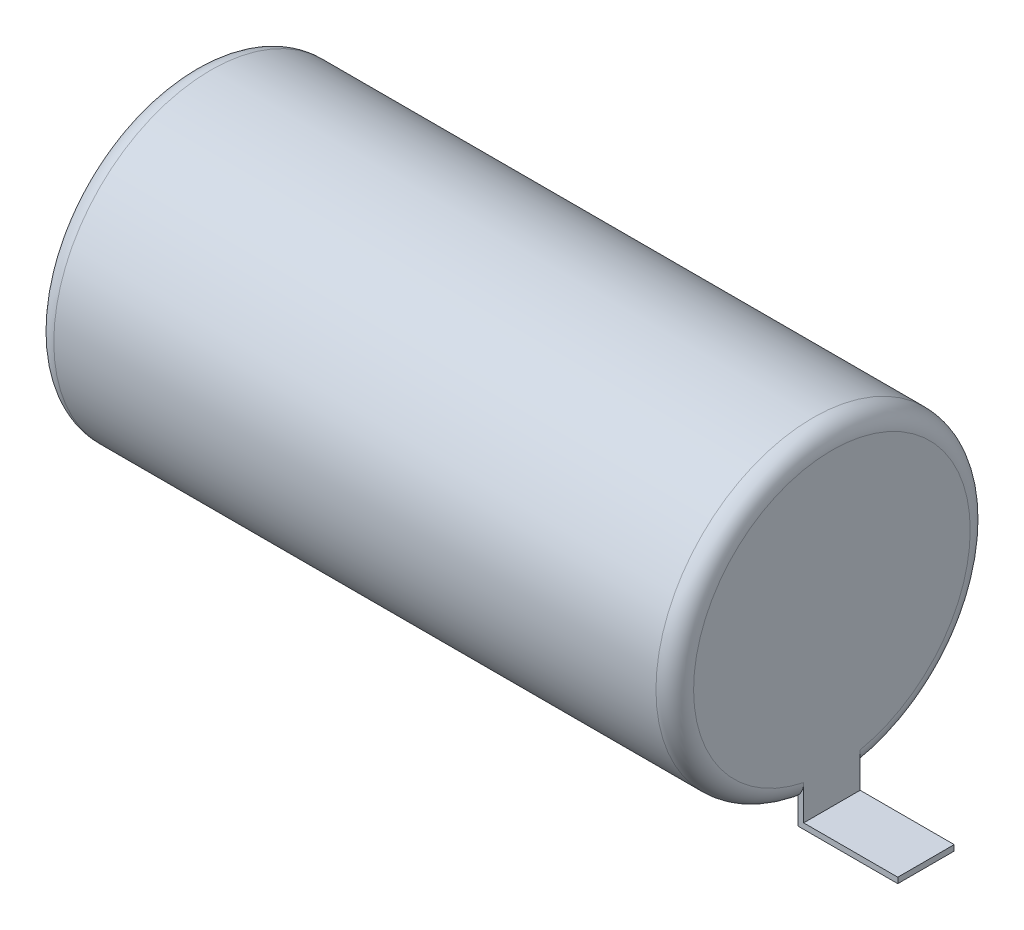
ISO-10303-21;
HEADER;
FILE_DESCRIPTION(('STEP AP214'),'2;1');
FILE_NAME('part.step','',(''),(''),'','','');
FILE_SCHEMA(('AUTOMOTIVE_DESIGN { 1 0 10303 214 1 1 1 1 }'));
ENDSEC;
DATA;
#1=APPLICATION_CONTEXT('core data for automotive mechanical design processes');
#2=APPLICATION_PROTOCOL_DEFINITION('international standard','automotive_design',2000,#1);
#3=PRODUCT_CONTEXT('',#1,'mechanical');
#4=PRODUCT('Part','Part','',(#3));
#5=PRODUCT_RELATED_PRODUCT_CATEGORY('part','',(#4));
#6=PRODUCT_DEFINITION_FORMATION('','',#4);
#7=PRODUCT_DEFINITION_CONTEXT('part definition',#1,'design');
#8=PRODUCT_DEFINITION('design','',#6,#7);
#9=PRODUCT_DEFINITION_SHAPE('','',#8);
#10=(LENGTH_UNIT() NAMED_UNIT(*) SI_UNIT(.MILLI.,.METRE.));
#11=(NAMED_UNIT(*) PLANE_ANGLE_UNIT() SI_UNIT($,.RADIAN.));
#12=(NAMED_UNIT(*) SI_UNIT($,.STERADIAN.) SOLID_ANGLE_UNIT());
#13=UNCERTAINTY_MEASURE_WITH_UNIT(LENGTH_MEASURE(1.E-05),#10,'distance_accuracy_value','');
#14=(GEOMETRIC_REPRESENTATION_CONTEXT(3) GLOBAL_UNCERTAINTY_ASSIGNED_CONTEXT((#13)) GLOBAL_UNIT_ASSIGNED_CONTEXT((#10,
#11,#12)) REPRESENTATION_CONTEXT('',''));
#15=CARTESIAN_POINT('',(0.,0.,0.));
#16=DIRECTION('',(0.,0.,1.));
#17=DIRECTION('',(1.,0.,0.));
#18=AXIS2_PLACEMENT_3D('',#15,#16,#17);
#19=CARTESIAN_POINT('',(-16.,0.,0.));
#20=DIRECTION('',(1.,0.,0.));
#21=DIRECTION('',(0.,0.,-1.));
#22=AXIS2_PLACEMENT_3D('',#19,#20,#21);
#23=TOROIDAL_SURFACE('',#22,7.35,1.);
#24=CARTESIAN_POINT('',(-16.,0.,0.));
#25=DIRECTION('',(1.,0.,0.));
#26=DIRECTION('',(0.,0.,-1.));
#27=AXIS2_PLACEMENT_3D('',#24,#25,#26);
#28=CIRCLE('',#27,8.35);
#29=CARTESIAN_POINT('',(-16.,0.,-8.35));
#30=VERTEX_POINT('',#29);
#31=EDGE_CURVE('E217',#30,#30,#28,.T.);
#32=ORIENTED_EDGE('',*,*,#31,.F.);
#33=EDGE_LOOP('',(#32));
#34=FACE_BOUND('',#33,.T.);
#35=CARTESIAN_POINT('',(-17.,0.,0.));
#36=DIRECTION('',(1.,0.,0.));
#37=DIRECTION('',(0.,0.,-1.));
#38=AXIS2_PLACEMENT_3D('',#35,#36,#37);
#39=CIRCLE('',#38,7.35);
#40=CARTESIAN_POINT('',(-17.,-7.19531097312687,1.5));
#41=VERTEX_POINT('',#40);
#42=CARTESIAN_POINT('',(-17.,-7.19531097312688,-1.5));
#43=VERTEX_POINT('',#42);
#44=EDGE_CURVE('E220',#41,#43,#39,.F.);
#45=ORIENTED_EDGE('',*,*,#44,.F.);
#46=CARTESIAN_POINT('',(-15.5067757970681,-6.30409923299321,1.5));
#47=CARTESIAN_POINT('',(-15.5305842653374,-6.29022336257219,1.5));
#48=CARTESIAN_POINT('',(-15.5549591096663,-6.27734333419591,1.5));
#49=CARTESIAN_POINT('',(-15.6046990759526,-6.25366062634084,1.5));
#50=CARTESIAN_POINT('',(-15.6300642444978,-6.24285804473339,1.5));
#51=CARTESIAN_POINT('',(-15.7073608834947,-6.21372212304803,1.5));
#52=CARTESIAN_POINT('',(-15.7605562522935,-6.19862402153742,1.5));
#53=CARTESIAN_POINT('',(-15.8687582447833,-6.17761792656011,1.5));
#54=CARTESIAN_POINT('',(-15.9237664941909,-6.1717184243746,1.5));
#55=CARTESIAN_POINT('',(-16.0339731529705,-6.16932456887729,1.5));
#56=CARTESIAN_POINT('',(-16.0891714783419,-6.1728264891976,1.5));
#57=CARTESIAN_POINT('',(-16.1977447366298,-6.18904562640387,1.5));
#58=CARTESIAN_POINT('',(-16.2511306389927,-6.20168973053703,1.5));
#59=CARTESIAN_POINT('',(-16.3550603895573,-6.23569237787235,1.5));
#60=CARTESIAN_POINT('',(-16.4056035557428,-6.25705300223981,1.5));
#61=CARTESIAN_POINT('',(-16.5028737573544,-6.30801449644528,1.5));
#62=CARTESIAN_POINT('',(-16.5495661129046,-6.3376814814608,1.5));
#63=CARTESIAN_POINT('',(-16.6374516761709,-6.4042624786784,1.5));
#64=CARTESIAN_POINT('',(-16.6786447395307,-6.44117668105717,1.5));
#65=CARTESIAN_POINT('',(-16.7554011842381,-6.52211702270089,1.5));
#66=CARTESIAN_POINT('',(-16.7908106051356,-6.56628913346842,1.5));
#67=CARTESIAN_POINT('',(-16.8539264131727,-6.65983174807836,1.5));
#68=CARTESIAN_POINT('',(-16.8816315861218,-6.70920306962857,1.5));
#69=CARTESIAN_POINT('',(-16.929247195065,-6.81305726264819,1.5));
#70=CARTESIAN_POINT('',(-16.9489479184186,-6.86763635005943,1.5));
#71=CARTESIAN_POINT('',(-16.9790514814456,-6.97930203969469,1.5));
#72=CARTESIAN_POINT('',(-16.9894535381439,-7.03638885265203,1.5));
#73=CARTESIAN_POINT('',(-17.0007597344184,-7.15230969163102,1.5));
#74=CARTESIAN_POINT('',(-17.0015283225254,-7.21115699767991,1.5));
#75=CARTESIAN_POINT('',(-16.9931660034458,-7.32814657860345,1.5));
#76=CARTESIAN_POINT('',(-16.9840349494277,-7.38628884300799,1.5));
#77=CARTESIAN_POINT('',(-16.9560922622193,-7.50013263557749,1.5));
#78=CARTESIAN_POINT('',(-16.9372916322517,-7.5558368600303,1.5));
#79=CARTESIAN_POINT('',(-16.8904829530109,-7.66323533308341,1.5));
#80=CARTESIAN_POINT('',(-16.8624754203273,-7.7149298064655,1.5));
#81=CARTESIAN_POINT('',(-16.7984205729262,-7.81210102602569,1.5));
#82=CARTESIAN_POINT('',(-16.7624835276978,-7.85765043182119,1.5));
#83=CARTESIAN_POINT('',(-16.683344715982,-7.94192958854867,1.5));
#84=CARTESIAN_POINT('',(-16.640143689483,-7.98066003331259,1.5));
#85=CARTESIAN_POINT('',(-16.5485372776916,-8.04946171674048,1.5));
#86=CARTESIAN_POINT('',(-16.5002393449575,-8.07967603265202,1.5));
#87=CARTESIAN_POINT('',(-16.3991947064606,-8.13141518622947,1.5));
#88=CARTESIAN_POINT('',(-16.3464485038068,-8.15294100499418,1.5));
#89=CARTESIAN_POINT('',(-16.2389052697222,-8.1863551252884,1.5));
#90=CARTESIAN_POINT('',(-16.1841539394948,-8.19839064024423,1.5));
#91=CARTESIAN_POINT('',(-16.0733921454941,-8.2130110849478,1.5));
#92=CARTESIAN_POINT('',(-16.0173815245852,-8.21559482863413,1.5));
#93=CARTESIAN_POINT('',(-15.9062006178464,-8.21124979677329,1.5));
#94=CARTESIAN_POINT('',(-15.8510272068893,-8.20439878523546,1.5));
#95=CARTESIAN_POINT('',(-15.7426439525426,-8.18152815186926,1.5));
#96=CARTESIAN_POINT('',(-15.6894321010441,-8.16551820038187,1.5));
#97=CARTESIAN_POINT('',(-15.6153504883957,-8.1362692152943,1.5));
#98=CARTESIAN_POINT('',(-15.5930577165142,-8.1264999244577,1.5));
#99=CARTESIAN_POINT('',(-15.5492914106264,-8.10537034823233,1.5));
#100=CARTESIAN_POINT('',(-15.5278164027691,-8.09401311607137,1.5));
#101=CARTESIAN_POINT('',(-15.5067757970681,-8.08188051333717,1.5));
#102=B_SPLINE_CURVE_WITH_KNOTS('',3,(#46,#47,#48,#49,#50,#51,#52,#53,#54,#55,#56,#57,#58,#59,
#60,#61,#62,#63,#64,#65,#66,#67,#68,#69,#70,#71,#72,#73,#74,#75,#76,#77,#78,#79,#80,#81,#82,#83,
#84,#85,#86,#87,#88,#89,#90,#91,#92,#93,#94,#95,#96,#97,#98,#99,#100,#101),.UNSPECIFIED.,.F.,
.F.,(4,2,2,2,2,2,2,2,2,2,2,2,2,2,2,2,2,2,2,2,2,2,2,2,2,2,2,4),(0.,0.0826221812848392,
0.165248254059607,0.330285193748819,0.495474390004246,0.660598121184733,0.824415712101748,
0.988272439181508,1.15347240624558,1.31867670895758,1.48773958171912,1.65682908373012,
1.83010026252789,2.00338602989359,2.17910738872757,2.35483135389687,2.53035579986591,
2.70587039902531,2.87908291695016,3.05227780023538,3.22236089138412,3.3924247714968,
3.55979567335305,3.72718757713088,3.89320801475991,4.05905348465827,4.13201744041258,
4.20484298554671),.UNSPECIFIED.);
#103=CARTESIAN_POINT('',(-16.7,-7.92340834426436,1.5));
#104=VERTEX_POINT('',#103);
#105=EDGE_CURVE('E11',#41,#104,#102,.T.);
#106=ORIENTED_EDGE('',*,*,#105,.T.);
#107=CARTESIAN_POINT('',(-16.7,0.,0.));
#108=DIRECTION('',(-1.,0.,0.));
#109=DIRECTION('',(0.,0.,1.));
#110=AXIS2_PLACEMENT_3D('',#107,#108,#109);
#111=CIRCLE('',#110,8.06414284285429);
#112=CARTESIAN_POINT('',(-16.7,-7.92340834426436,-1.5));
#113=VERTEX_POINT('',#112);
#114=EDGE_CURVE('E270',#104,#113,#111,.F.);
#115=ORIENTED_EDGE('',*,*,#114,.T.);
#116=CARTESIAN_POINT('',(-15.5067757970681,-8.08188051333716,-1.5));
#117=CARTESIAN_POINT('',(-15.5308383578399,-8.0957566107559,-1.5));
#118=CARTESIAN_POINT('',(-15.5554714134462,-8.10861789151575,-1.5));
#119=CARTESIAN_POINT('',(-15.6057287201951,-8.13223021688347,-1.5));
#120=CARTESIAN_POINT('',(-15.6313529677606,-8.1429812691064,-1.5));
#121=CARTESIAN_POINT('',(-15.7094116027768,-8.17191996821105,-1.5));
#122=CARTESIAN_POINT('',(-15.7631034176229,-8.18683436404292,-1.5));
#123=CARTESIAN_POINT('',(-15.8722421248031,-8.20741511907732,-1.5));
#124=CARTESIAN_POINT('',(-15.9276901790152,-8.21307521989462,-1.5));
#125=CARTESIAN_POINT('',(-16.0387385178251,-8.21496753356762,-1.5));
#126=CARTESIAN_POINT('',(-16.0943387545839,-8.21120243033194,-1.5));
#127=CARTESIAN_POINT('',(-16.2039089823935,-8.19439349739108,-1.5));
#128=CARTESIAN_POINT('',(-16.257884140551,-8.18138326224874,-1.5));
#129=CARTESIAN_POINT('',(-16.362906627279,-8.14651747548187,-1.5));
#130=CARTESIAN_POINT('',(-16.4139534156696,-8.12466029786382,-1.5));
#131=CARTESIAN_POINT('',(-16.5118849763461,-8.0726596086078,-1.5));
#132=CARTESIAN_POINT('',(-16.5587530030398,-8.04248458060819,-1.5));
#133=CARTESIAN_POINT('',(-16.6468328216077,-7.97478567048807,-1.5));
#134=CARTESIAN_POINT('',(-16.6880447320793,-7.9372619424949,-1.5));
#135=CARTESIAN_POINT('',(-16.7642022652973,-7.85545045041571,-1.5));
#136=CARTESIAN_POINT('',(-16.799064620725,-7.8110852001287,-1.5));
#137=CARTESIAN_POINT('',(-16.8609955130221,-7.71721337824321,-1.5));
#138=CARTESIAN_POINT('',(-16.8880632163161,-7.66770625753281,-1.5));
#139=CARTESIAN_POINT('',(-16.9341339248544,-7.56404678898978,-1.5));
#140=CARTESIAN_POINT('',(-16.9529898121658,-7.50982905957159,-1.5));
#141=CARTESIAN_POINT('',(-16.9814987999338,-7.39902653482781,-1.5));
#142=CARTESIAN_POINT('',(-16.991151085684,-7.3424415304128,-1.5));
#143=CARTESIAN_POINT('',(-17.0011262173479,-7.22749985459626,-1.5));
#144=CARTESIAN_POINT('',(-17.0012903440484,-7.16912938014377,-1.5));
#145=CARTESIAN_POINT('',(-16.9919134443733,-7.05317131497763,-1.5));
#146=CARTESIAN_POINT('',(-16.9823717049735,-6.99558378209636,-1.5));
#147=CARTESIAN_POINT('',(-16.953710524679,-6.88227754792207,-1.5));
#148=CARTESIAN_POINT('',(-16.9345040933504,-6.82658081548269,-1.5));
#149=CARTESIAN_POINT('',(-16.8869718664512,-6.7192202733008,-1.5));
#150=CARTESIAN_POINT('',(-16.8586459909411,-6.66755649891542,-1.5));
#151=CARTESIAN_POINT('',(-16.7937695740262,-6.5700274870711,-1.5));
#152=CARTESIAN_POINT('',(-16.7572585298431,-6.5241360028987,-1.5));
#153=CARTESIAN_POINT('',(-16.6769092177,-6.43928692575321,-1.5));
#154=CARTESIAN_POINT('',(-16.6330717081814,-6.40032861591367,-1.5));
#155=CARTESIAN_POINT('',(-16.5402185279286,-6.33130698491065,-1.5));
#156=CARTESIAN_POINT('',(-16.4913221834213,-6.30108322842729,-1.5));
#157=CARTESIAN_POINT('',(-16.3890450787671,-6.24953334441582,-1.5));
#158=CARTESIAN_POINT('',(-16.3356651591678,-6.22820555359056,-1.5));
#159=CARTESIAN_POINT('',(-16.2274539524268,-6.195630779563,-1.5));
#160=CARTESIAN_POINT('',(-16.1726983298977,-6.18413222404921,-1.5));
#161=CARTESIAN_POINT('',(-16.0620167422656,-6.17067383691746,-1.5));
#162=CARTESIAN_POINT('',(-16.0060907054638,-6.16871459139841,-1.5));
#163=CARTESIAN_POINT('',(-15.8956980603267,-6.1743517274725,-1.5));
#164=CARTESIAN_POINT('',(-15.8412228763283,-6.18178471482942,-1.5));
#165=CARTESIAN_POINT('',(-15.7343196106212,-6.20568068141844,-1.5));
#166=CARTESIAN_POINT('',(-15.6818894710572,-6.22213431852547,-1.5));
#167=CARTESIAN_POINT('',(-15.6097865010826,-6.25154784597752,-1.5));
#168=CARTESIAN_POINT('',(-15.5886499600778,-6.26105593547129,-1.5));
#169=CARTESIAN_POINT('',(-15.5471362326949,-6.2815107035309,-1.5));
#170=CARTESIAN_POINT('',(-15.5267576374871,-6.29245452224264,-1.5));
#171=CARTESIAN_POINT('',(-15.5067757970683,-6.30409923299312,-1.5));
#172=B_SPLINE_CURVE_WITH_KNOTS('',3,(#116,#117,#118,#119,#120,#121,#122,#123,#124,#125,#126,
#127,#128,#129,#130,#131,#132,#133,#134,#135,#136,#137,#138,#139,#140,#141,#142,#143,#144,#145,
#146,#147,#148,#149,#150,#151,#152,#153,#154,#155,#156,#157,#158,#159,#160,#161,#162,#163,#164,
#165,#166,#167,#168,#169,#170,#171),.UNSPECIFIED.,.F.,.F.,(4,2,2,2,2,2,2,2,2,2,2,2,2,2,2,2,2,2,
2,2,2,2,2,2,2,2,2,4),(0.,0.0832804639960968,0.166560627457247,0.332876426853083,
0.499304653879879,0.66568549441653,0.831464818807183,0.997274625886492,1.16372153346065,
1.3301649504481,1.49865463901482,1.66716233951222,1.83857581579042,2.01000446425008,
2.18429997873436,2.3586082984568,2.53451438156462,2.71042200667596,2.88549840026635,
3.06055668102731,3.23215862043355,3.40372846067138,3.57076303961578,3.73780788110032,
3.90198629286784,4.06599499558828,4.13547872655523,4.2048260955342),.UNSPECIFIED.);
#173=EDGE_CURVE('E54',#113,#43,#172,.T.);
#174=ORIENTED_EDGE('',*,*,#173,.T.);
#175=EDGE_LOOP('',(#45,#106,#115,#174));
#176=FACE_BOUND('',#175,.T.);
#177=ADVANCED_FACE('F40',(#34,#176),#23,.T.);
#178=CARTESIAN_POINT('',(17.,0.,0.));
#179=DIRECTION('',(1.,0.,0.));
#180=DIRECTION('',(0.,0.,-1.));
#181=AXIS2_PLACEMENT_3D('',#178,#179,#180);
#182=PLANE('',#181);
#183=DIRECTION('',(0.,-1.,0.));
#184=VECTOR('',#183,1.);
#185=CARTESIAN_POINT('',(17.,-9.35,1.5));
#186=LINE('',#185,#184);
#187=CARTESIAN_POINT('',(17.,-7.19531097312688,1.5));
#188=VERTEX_POINT('',#187);
#189=CARTESIAN_POINT('',(17.,-9.05,1.5));
#190=VERTEX_POINT('',#189);
#191=EDGE_CURVE('E198',#188,#190,#186,.T.);
#192=ORIENTED_EDGE('',*,*,#191,.T.);
#193=DIRECTION('',(0.,0.,1.));
#194=VECTOR('',#193,1.);
#195=CARTESIAN_POINT('',(17.,-9.05,1.5));
#196=LINE('',#195,#194);
#197=CARTESIAN_POINT('',(17.,-9.05,-1.5));
#198=VERTEX_POINT('',#197);
#199=EDGE_CURVE('E147',#198,#190,#196,.T.);
#200=ORIENTED_EDGE('',*,*,#199,.F.);
#201=DIRECTION('',(0.,1.,0.));
#202=VECTOR('',#201,1.);
#203=CARTESIAN_POINT('',(17.,-9.35,-1.5));
#204=LINE('',#203,#202);
#205=CARTESIAN_POINT('',(17.,-7.19531097312687,-1.5));
#206=VERTEX_POINT('',#205);
#207=EDGE_CURVE('E202',#198,#206,#204,.T.);
#208=ORIENTED_EDGE('',*,*,#207,.T.);
#209=CARTESIAN_POINT('',(17.,0.,0.));
#210=DIRECTION('',(1.,0.,0.));
#211=DIRECTION('',(0.,0.,-1.));
#212=AXIS2_PLACEMENT_3D('',#209,#210,#211);
#213=CIRCLE('',#212,7.35);
#214=EDGE_CURVE('E222',#206,#188,#213,.T.);
#215=ORIENTED_EDGE('',*,*,#214,.T.);
#216=EDGE_LOOP('',(#192,#200,#208,#215));
#217=FACE_BOUND('',#216,.T.);
#218=ADVANCED_FACE('F250',(#217),#182,.T.);
#219=CARTESIAN_POINT('',(17.,0.,0.));
#220=DIRECTION('',(-1.,0.,0.));
#221=DIRECTION('',(0.,0.,1.));
#222=AXIS2_PLACEMENT_3D('',#219,#220,#221);
#223=CYLINDRICAL_SURFACE('',#222,8.35);
#224=ORIENTED_EDGE('',*,*,#31,.T.);
#225=EDGE_LOOP('',(#224));
#226=FACE_BOUND('',#225,.T.);
#227=CARTESIAN_POINT('',(16.,0.,0.));
#228=DIRECTION('',(1.,0.,0.));
#229=DIRECTION('',(0.,0.,-1.));
#230=AXIS2_PLACEMENT_3D('',#227,#228,#229);
#231=CIRCLE('',#230,8.35);
#232=CARTESIAN_POINT('',(16.,0.,-8.35));
#233=VERTEX_POINT('',#232);
#234=EDGE_CURVE('E213',#233,#233,#231,.F.);
#235=ORIENTED_EDGE('',*,*,#234,.T.);
#236=EDGE_LOOP('',(#235));
#237=FACE_BOUND('',#236,.T.);
#238=ADVANCED_FACE('F253',(#226,#237),#223,.T.);
#239=CARTESIAN_POINT('',(-17.,0.,0.));
#240=DIRECTION('',(1.,0.,0.));
#241=DIRECTION('',(0.,0.,-1.));
#242=AXIS2_PLACEMENT_3D('',#239,#240,#241);
#243=PLANE('',#242);
#244=DIRECTION('',(0.,1.,0.));
#245=VECTOR('',#244,1.);
#246=CARTESIAN_POINT('',(-17.,-9.35,-1.5));
#247=LINE('',#246,#245);
#248=CARTESIAN_POINT('',(-17.,-9.05,-1.5));
#249=VERTEX_POINT('',#248);
#250=EDGE_CURVE('E170',#249,#43,#247,.T.);
#251=ORIENTED_EDGE('',*,*,#250,.F.);
#252=DIRECTION('',(0.,0.,1.));
#253=VECTOR('',#252,1.);
#254=CARTESIAN_POINT('',(-17.,-9.05,1.5));
#255=LINE('',#254,#253);
#256=CARTESIAN_POINT('',(-17.,-9.05,1.5));
#257=VERTEX_POINT('',#256);
#258=EDGE_CURVE('E61',#249,#257,#255,.T.);
#259=ORIENTED_EDGE('',*,*,#258,.T.);
#260=DIRECTION('',(0.,-1.,0.));
#261=VECTOR('',#260,1.);
#262=CARTESIAN_POINT('',(-17.,-9.35,1.5));
#263=LINE('',#262,#261);
#264=EDGE_CURVE('E68',#41,#257,#263,.T.);
#265=ORIENTED_EDGE('',*,*,#264,.F.);
#266=ORIENTED_EDGE('',*,*,#44,.T.);
#267=EDGE_LOOP('',(#251,#259,#265,#266));
#268=FACE_BOUND('',#267,.T.);
#269=ADVANCED_FACE('F255',(#268),#243,.F.);
#270=CARTESIAN_POINT('',(16.,0.,0.));
#271=DIRECTION('',(1.,0.,0.));
#272=DIRECTION('',(0.,0.,-1.));
#273=AXIS2_PLACEMENT_3D('',#270,#271,#272);
#274=TOROIDAL_SURFACE('',#273,7.35,1.);
#275=CARTESIAN_POINT('',(15.5067757970681,-8.08188051333716,-1.5));
#276=CARTESIAN_POINT('',(15.5308383578399,-8.0957566107559,-1.5));
#277=CARTESIAN_POINT('',(15.5554714134462,-8.10861789151575,-1.5));
#278=CARTESIAN_POINT('',(15.6057287201951,-8.13223021688347,-1.5));
#279=CARTESIAN_POINT('',(15.6313529677606,-8.1429812691064,-1.5));
#280=CARTESIAN_POINT('',(15.7094116027768,-8.17191996821105,-1.5));
#281=CARTESIAN_POINT('',(15.7631034176229,-8.18683436404292,-1.5));
#282=CARTESIAN_POINT('',(15.8722421248031,-8.20741511907732,-1.5));
#283=CARTESIAN_POINT('',(15.9276901790152,-8.21307521989462,-1.5));
#284=CARTESIAN_POINT('',(16.0387385178251,-8.21496753356762,-1.5));
#285=CARTESIAN_POINT('',(16.0943387545839,-8.21120243033194,-1.5));
#286=CARTESIAN_POINT('',(16.2039089823935,-8.19439349739108,-1.5));
#287=CARTESIAN_POINT('',(16.257884140551,-8.18138326224874,-1.5));
#288=CARTESIAN_POINT('',(16.362906627279,-8.14651747548187,-1.5));
#289=CARTESIAN_POINT('',(16.4139534156696,-8.12466029786382,-1.5));
#290=CARTESIAN_POINT('',(16.5118849763461,-8.0726596086078,-1.5));
#291=CARTESIAN_POINT('',(16.5587530030398,-8.04248458060819,-1.5));
#292=CARTESIAN_POINT('',(16.6468328216077,-7.97478567048807,-1.5));
#293=CARTESIAN_POINT('',(16.6880447320793,-7.9372619424949,-1.5));
#294=CARTESIAN_POINT('',(16.7642022652973,-7.85545045041571,-1.5));
#295=CARTESIAN_POINT('',(16.799064620725,-7.8110852001287,-1.5));
#296=CARTESIAN_POINT('',(16.8609955130221,-7.71721337824321,-1.5));
#297=CARTESIAN_POINT('',(16.8880632163161,-7.66770625753281,-1.5));
#298=CARTESIAN_POINT('',(16.9341339248544,-7.56404678898978,-1.5));
#299=CARTESIAN_POINT('',(16.9529898121658,-7.50982905957159,-1.5));
#300=CARTESIAN_POINT('',(16.9814987999338,-7.39902653482781,-1.5));
#301=CARTESIAN_POINT('',(16.991151085684,-7.3424415304128,-1.5));
#302=CARTESIAN_POINT('',(17.0011262173479,-7.22749985459626,-1.5));
#303=CARTESIAN_POINT('',(17.0012903440484,-7.16912938014377,-1.5));
#304=CARTESIAN_POINT('',(16.9919134443733,-7.05317131497763,-1.5));
#305=CARTESIAN_POINT('',(16.9823717049735,-6.99558378209636,-1.5));
#306=CARTESIAN_POINT('',(16.953710524679,-6.88227754792207,-1.5));
#307=CARTESIAN_POINT('',(16.9345040933504,-6.82658081548269,-1.5));
#308=CARTESIAN_POINT('',(16.8869718664512,-6.7192202733008,-1.5));
#309=CARTESIAN_POINT('',(16.8586459909411,-6.66755649891542,-1.5));
#310=CARTESIAN_POINT('',(16.7937695740262,-6.5700274870711,-1.5));
#311=CARTESIAN_POINT('',(16.7572585298431,-6.5241360028987,-1.5));
#312=CARTESIAN_POINT('',(16.6769092177,-6.43928692575321,-1.5));
#313=CARTESIAN_POINT('',(16.6330717081814,-6.40032861591367,-1.5));
#314=CARTESIAN_POINT('',(16.5402185279286,-6.33130698491065,-1.5));
#315=CARTESIAN_POINT('',(16.4913221834213,-6.30108322842729,-1.5));
#316=CARTESIAN_POINT('',(16.3890450787671,-6.24953334441582,-1.5));
#317=CARTESIAN_POINT('',(16.3356651591678,-6.22820555359056,-1.5));
#318=CARTESIAN_POINT('',(16.2274539524268,-6.195630779563,-1.5));
#319=CARTESIAN_POINT('',(16.1726983298977,-6.18413222404921,-1.5));
#320=CARTESIAN_POINT('',(16.0620167422656,-6.17067383691746,-1.5));
#321=CARTESIAN_POINT('',(16.0060907054638,-6.16871459139841,-1.5));
#322=CARTESIAN_POINT('',(15.8956980603267,-6.1743517274725,-1.5));
#323=CARTESIAN_POINT('',(15.8412228763283,-6.18178471482942,-1.5));
#324=CARTESIAN_POINT('',(15.7343196106212,-6.20568068141844,-1.5));
#325=CARTESIAN_POINT('',(15.6818894710572,-6.22213431852547,-1.5));
#326=CARTESIAN_POINT('',(15.6097865010826,-6.25154784597752,-1.5));
#327=CARTESIAN_POINT('',(15.5886499600778,-6.26105593547129,-1.5));
#328=CARTESIAN_POINT('',(15.5471362326949,-6.2815107035309,-1.5));
#329=CARTESIAN_POINT('',(15.5267576374871,-6.29245452224264,-1.5));
#330=CARTESIAN_POINT('',(15.5067757970683,-6.30409923299312,-1.5));
#331=B_SPLINE_CURVE_WITH_KNOTS('',3,(#275,#276,#277,#278,#279,#280,#281,#282,#283,#284,#285,
#286,#287,#288,#289,#290,#291,#292,#293,#294,#295,#296,#297,#298,#299,#300,#301,#302,#303,#304,
#305,#306,#307,#308,#309,#310,#311,#312,#313,#314,#315,#316,#317,#318,#319,#320,#321,#322,#323,
#324,#325,#326,#327,#328,#329,#330),.UNSPECIFIED.,.F.,.F.,(4,2,2,2,2,2,2,2,2,2,2,2,2,2,2,2,2,2,
2,2,2,2,2,2,2,2,2,4),(0.,0.0832804639960968,0.166560627457247,0.332876426853083,
0.499304653879879,0.66568549441653,0.831464818807183,0.997274625886492,1.16372153346065,
1.3301649504481,1.49865463901482,1.66716233951222,1.83857581579042,2.01000446425008,
2.18429997873436,2.3586082984568,2.53451438156462,2.71042200667596,2.88549840026635,
3.06055668102731,3.23215862043355,3.40372846067138,3.57076303961578,3.73780788110032,
3.90198629286784,4.06599499558828,4.13547872655523,4.2048260955342),.UNSPECIFIED.);
#332=CARTESIAN_POINT('',(16.7,-7.92340834426436,-1.5));
#333=VERTEX_POINT('',#332);
#334=EDGE_CURVE('E235',#333,#206,#331,.T.);
#335=ORIENTED_EDGE('',*,*,#334,.F.);
#336=CARTESIAN_POINT('',(16.7,0.,0.));
#337=DIRECTION('',(1.,0.,0.));
#338=DIRECTION('',(0.,0.,-1.));
#339=AXIS2_PLACEMENT_3D('',#336,#337,#338);
#340=CIRCLE('',#339,8.06414284285429);
#341=CARTESIAN_POINT('',(16.7,-7.92340834426436,1.5));
#342=VERTEX_POINT('',#341);
#343=EDGE_CURVE('E225',#333,#342,#340,.F.);
#344=ORIENTED_EDGE('',*,*,#343,.T.);
#345=CARTESIAN_POINT('',(15.5067757970681,-6.30409923299321,1.5));
#346=CARTESIAN_POINT('',(15.5305842653374,-6.29022336257219,1.5));
#347=CARTESIAN_POINT('',(15.5549591096663,-6.27734333419591,1.5));
#348=CARTESIAN_POINT('',(15.6046990759526,-6.25366062634084,1.5));
#349=CARTESIAN_POINT('',(15.6300642444978,-6.24285804473339,1.5));
#350=CARTESIAN_POINT('',(15.7073608834947,-6.21372212304803,1.5));
#351=CARTESIAN_POINT('',(15.7605562522935,-6.19862402153742,1.5));
#352=CARTESIAN_POINT('',(15.8687582447833,-6.17761792656011,1.5));
#353=CARTESIAN_POINT('',(15.9237664941909,-6.1717184243746,1.5));
#354=CARTESIAN_POINT('',(16.0339731529705,-6.16932456887729,1.5));
#355=CARTESIAN_POINT('',(16.0891714783419,-6.1728264891976,1.5));
#356=CARTESIAN_POINT('',(16.1977447366298,-6.18904562640387,1.5));
#357=CARTESIAN_POINT('',(16.2511306389927,-6.20168973053703,1.5));
#358=CARTESIAN_POINT('',(16.3550603895573,-6.23569237787235,1.5));
#359=CARTESIAN_POINT('',(16.4056035557428,-6.25705300223981,1.5));
#360=CARTESIAN_POINT('',(16.5028737573544,-6.30801449644528,1.5));
#361=CARTESIAN_POINT('',(16.5495661129046,-6.3376814814608,1.5));
#362=CARTESIAN_POINT('',(16.6374516761709,-6.4042624786784,1.5));
#363=CARTESIAN_POINT('',(16.6786447395307,-6.44117668105717,1.5));
#364=CARTESIAN_POINT('',(16.7554011842381,-6.52211702270089,1.5));
#365=CARTESIAN_POINT('',(16.7908106051356,-6.56628913346842,1.5));
#366=CARTESIAN_POINT('',(16.8539264131727,-6.65983174807836,1.5));
#367=CARTESIAN_POINT('',(16.8816315861218,-6.70920306962857,1.5));
#368=CARTESIAN_POINT('',(16.929247195065,-6.81305726264819,1.5));
#369=CARTESIAN_POINT('',(16.9489479184186,-6.86763635005943,1.5));
#370=CARTESIAN_POINT('',(16.9790514814456,-6.97930203969469,1.5));
#371=CARTESIAN_POINT('',(16.9894535381439,-7.03638885265203,1.5));
#372=CARTESIAN_POINT('',(17.0007597344184,-7.15230969163102,1.5));
#373=CARTESIAN_POINT('',(17.0015283225254,-7.21115699767991,1.5));
#374=CARTESIAN_POINT('',(16.9931660034458,-7.32814657860345,1.5));
#375=CARTESIAN_POINT('',(16.9840349494277,-7.38628884300799,1.5));
#376=CARTESIAN_POINT('',(16.9560922622193,-7.50013263557749,1.5));
#377=CARTESIAN_POINT('',(16.9372916322517,-7.5558368600303,1.5));
#378=CARTESIAN_POINT('',(16.8904829530109,-7.66323533308341,1.5));
#379=CARTESIAN_POINT('',(16.8624754203273,-7.7149298064655,1.5));
#380=CARTESIAN_POINT('',(16.7984205729262,-7.81210102602569,1.5));
#381=CARTESIAN_POINT('',(16.7624835276978,-7.85765043182119,1.5));
#382=CARTESIAN_POINT('',(16.683344715982,-7.94192958854867,1.5));
#383=CARTESIAN_POINT('',(16.640143689483,-7.98066003331259,1.5));
#384=CARTESIAN_POINT('',(16.5485372776916,-8.04946171674048,1.5));
#385=CARTESIAN_POINT('',(16.5002393449575,-8.07967603265202,1.5));
#386=CARTESIAN_POINT('',(16.3991947064606,-8.13141518622947,1.5));
#387=CARTESIAN_POINT('',(16.3464485038068,-8.15294100499418,1.5));
#388=CARTESIAN_POINT('',(16.2389052697222,-8.1863551252884,1.5));
#389=CARTESIAN_POINT('',(16.1841539394948,-8.19839064024423,1.5));
#390=CARTESIAN_POINT('',(16.0733921454941,-8.2130110849478,1.5));
#391=CARTESIAN_POINT('',(16.0173815245852,-8.21559482863413,1.5));
#392=CARTESIAN_POINT('',(15.9062006178464,-8.21124979677329,1.5));
#393=CARTESIAN_POINT('',(15.8510272068893,-8.20439878523546,1.5));
#394=CARTESIAN_POINT('',(15.7426439525426,-8.18152815186926,1.5));
#395=CARTESIAN_POINT('',(15.6894321010441,-8.16551820038187,1.5));
#396=CARTESIAN_POINT('',(15.6153504883957,-8.1362692152943,1.5));
#397=CARTESIAN_POINT('',(15.5930577165142,-8.1264999244577,1.5));
#398=CARTESIAN_POINT('',(15.5492914106264,-8.10537034823233,1.5));
#399=CARTESIAN_POINT('',(15.5278164027691,-8.09401311607137,1.5));
#400=CARTESIAN_POINT('',(15.5067757970681,-8.08188051333717,1.5));
#401=B_SPLINE_CURVE_WITH_KNOTS('',3,(#345,#346,#347,#348,#349,#350,#351,#352,#353,#354,#355,
#356,#357,#358,#359,#360,#361,#362,#363,#364,#365,#366,#367,#368,#369,#370,#371,#372,#373,#374,
#375,#376,#377,#378,#379,#380,#381,#382,#383,#384,#385,#386,#387,#388,#389,#390,#391,#392,#393,
#394,#395,#396,#397,#398,#399,#400),.UNSPECIFIED.,.F.,.F.,(4,2,2,2,2,2,2,2,2,2,2,2,2,2,2,2,2,2,
2,2,2,2,2,2,2,2,2,4),(0.,0.0826221812848392,0.165248254059607,0.330285193748819,
0.495474390004246,0.660598121184733,0.824415712101748,0.988272439181508,1.15347240624558,
1.31867670895758,1.48773958171912,1.65682908373012,1.83010026252789,2.00338602989359,
2.17910738872757,2.35483135389687,2.53035579986591,2.70587039902531,2.87908291695016,
3.05227780023538,3.22236089138412,3.3924247714968,3.55979567335305,3.72718757713088,
3.89320801475991,4.05905348465827,4.13201744041258,4.20484298554671),.UNSPECIFIED.);
#402=EDGE_CURVE('E228',#188,#342,#401,.T.);
#403=ORIENTED_EDGE('',*,*,#402,.F.);
#404=ORIENTED_EDGE('',*,*,#214,.F.);
#405=EDGE_LOOP('',(#335,#344,#403,#404));
#406=FACE_BOUND('',#405,.T.);
#407=ORIENTED_EDGE('',*,*,#234,.F.);
#408=EDGE_LOOP('',(#407));
#409=FACE_BOUND('',#408,.T.);
#410=ADVANCED_FACE('F42',(#406,#409),#274,.T.);
#411=CARTESIAN_POINT('',(16.7,-9.35,-1.5));
#412=DIRECTION('',(0.,0.,-1.));
#413=DIRECTION('',(-1.,0.,0.));
#414=AXIS2_PLACEMENT_3D('',#411,#412,#413);
#415=PLANE('',#414);
#416=DIRECTION('',(0.,1.,0.));
#417=VECTOR('',#416,1.);
#418=CARTESIAN_POINT('',(16.7,-9.35,-1.5));
#419=LINE('',#418,#417);
#420=CARTESIAN_POINT('',(16.7,-9.35,-1.5));
#421=VERTEX_POINT('',#420);
#422=EDGE_CURVE('E205',#421,#333,#419,.T.);
#423=ORIENTED_EDGE('',*,*,#422,.T.);
#424=ORIENTED_EDGE('',*,*,#334,.T.);
#425=ORIENTED_EDGE('',*,*,#207,.F.);
#426=DIRECTION('',(-1.,0.,0.));
#427=VECTOR('',#426,1.);
#428=CARTESIAN_POINT('',(22.,-9.05,-1.5));
#429=LINE('',#428,#427);
#430=CARTESIAN_POINT('',(22.,-9.05,-1.5));
#431=VERTEX_POINT('',#430);
#432=EDGE_CURVE('E195',#431,#198,#429,.T.);
#433=ORIENTED_EDGE('',*,*,#432,.F.);
#434=DIRECTION('',(0.,1.,0.));
#435=VECTOR('',#434,1.);
#436=CARTESIAN_POINT('',(22.,-9.35,-1.5));
#437=LINE('',#436,#435);
#438=CARTESIAN_POINT('',(22.,-9.35,-1.5));
#439=VERTEX_POINT('',#438);
#440=EDGE_CURVE('E183',#439,#431,#437,.T.);
#441=ORIENTED_EDGE('',*,*,#440,.F.);
#442=DIRECTION('',(1.,0.,0.));
#443=VECTOR('',#442,1.);
#444=CARTESIAN_POINT('',(16.7,-9.35,-1.5));
#445=LINE('',#444,#443);
#446=EDGE_CURVE('E211',#421,#439,#445,.T.);
#447=ORIENTED_EDGE('',*,*,#446,.F.);
#448=EDGE_LOOP('',(#423,#424,#425,#433,#441,#447));
#449=FACE_BOUND('',#448,.T.);
#450=ADVANCED_FACE('F288',(#449),#415,.T.);
#451=CARTESIAN_POINT('',(16.7,-9.35,1.5));
#452=DIRECTION('',(0.,-1.,0.));
#453=DIRECTION('',(0.,0.,-1.));
#454=AXIS2_PLACEMENT_3D('',#451,#452,#453);
#455=PLANE('',#454);
#456=ORIENTED_EDGE('',*,*,#446,.T.);
#457=DIRECTION('',(0.,0.,-1.));
#458=VECTOR('',#457,1.);
#459=CARTESIAN_POINT('',(22.,-9.35,1.5));
#460=LINE('',#459,#458);
#461=CARTESIAN_POINT('',(22.,-9.35,1.5));
#462=VERTEX_POINT('',#461);
#463=EDGE_CURVE('E180',#462,#439,#460,.T.);
#464=ORIENTED_EDGE('',*,*,#463,.F.);
#465=DIRECTION('',(1.,0.,0.));
#466=VECTOR('',#465,1.);
#467=CARTESIAN_POINT('',(16.7,-9.35,1.5));
#468=LINE('',#467,#466);
#469=CARTESIAN_POINT('',(16.7,-9.35,1.5));
#470=VERTEX_POINT('',#469);
#471=EDGE_CURVE('E208',#470,#462,#468,.T.);
#472=ORIENTED_EDGE('',*,*,#471,.F.);
#473=DIRECTION('',(0.,0.,-1.));
#474=VECTOR('',#473,1.);
#475=CARTESIAN_POINT('',(16.7,-9.35,1.5));
#476=LINE('',#475,#474);
#477=EDGE_CURVE('E201',#470,#421,#476,.T.);
#478=ORIENTED_EDGE('',*,*,#477,.T.);
#479=EDGE_LOOP('',(#456,#464,#472,#478));
#480=FACE_BOUND('',#479,.T.);
#481=ADVANCED_FACE('F248',(#480),#455,.T.);
#482=CARTESIAN_POINT('',(16.7,-9.35,1.5));
#483=DIRECTION('',(0.,0.,1.));
#484=DIRECTION('',(0.,-1.,0.));
#485=AXIS2_PLACEMENT_3D('',#482,#483,#484);
#486=PLANE('',#485);
#487=ORIENTED_EDGE('',*,*,#191,.F.);
#488=ORIENTED_EDGE('',*,*,#402,.T.);
#489=DIRECTION('',(0.,-1.,0.));
#490=VECTOR('',#489,1.);
#491=CARTESIAN_POINT('',(16.7,-9.35,1.5));
#492=LINE('',#491,#490);
#493=EDGE_CURVE('E199',#342,#470,#492,.T.);
#494=ORIENTED_EDGE('',*,*,#493,.T.);
#495=ORIENTED_EDGE('',*,*,#471,.T.);
#496=DIRECTION('',(0.,-1.,0.));
#497=VECTOR('',#496,1.);
#498=CARTESIAN_POINT('',(22.,-9.05,1.5));
#499=LINE('',#498,#497);
#500=CARTESIAN_POINT('',(22.,-9.05,1.5));
#501=VERTEX_POINT('',#500);
#502=EDGE_CURVE('E187',#501,#462,#499,.T.);
#503=ORIENTED_EDGE('',*,*,#502,.F.);
#504=DIRECTION('',(-1.,0.,0.));
#505=VECTOR('',#504,1.);
#506=CARTESIAN_POINT('',(22.,-9.05,1.5));
#507=LINE('',#506,#505);
#508=EDGE_CURVE('E190',#501,#190,#507,.T.);
#509=ORIENTED_EDGE('',*,*,#508,.T.);
#510=EDGE_LOOP('',(#487,#488,#494,#495,#503,#509));
#511=FACE_BOUND('',#510,.T.);
#512=ADVANCED_FACE('F242',(#511),#486,.T.);
#513=CARTESIAN_POINT('',(16.7,0.,0.));
#514=DIRECTION('',(1.,0.,0.));
#515=DIRECTION('',(0.,0.,-1.));
#516=AXIS2_PLACEMENT_3D('',#513,#514,#515);
#517=PLANE('',#516);
#518=ORIENTED_EDGE('',*,*,#343,.F.);
#519=ORIENTED_EDGE('',*,*,#422,.F.);
#520=ORIENTED_EDGE('',*,*,#477,.F.);
#521=ORIENTED_EDGE('',*,*,#493,.F.);
#522=EDGE_LOOP('',(#518,#519,#520,#521));
#523=FACE_BOUND('',#522,.T.);
#524=ADVANCED_FACE('F247',(#523),#517,.F.);
#525=CARTESIAN_POINT('',(22.,-9.05,1.5));
#526=DIRECTION('',(0.,-1.,0.));
#527=DIRECTION('',(0.,0.,-1.));
#528=AXIS2_PLACEMENT_3D('',#525,#526,#527);
#529=PLANE('',#528);
#530=ORIENTED_EDGE('',*,*,#199,.T.);
#531=ORIENTED_EDGE('',*,*,#508,.F.);
#532=DIRECTION('',(0.,0.,1.));
#533=VECTOR('',#532,1.);
#534=CARTESIAN_POINT('',(22.,-9.05,1.5));
#535=LINE('',#534,#533);
#536=EDGE_CURVE('E185',#431,#501,#535,.T.);
#537=ORIENTED_EDGE('',*,*,#536,.F.);
#538=ORIENTED_EDGE('',*,*,#432,.T.);
#539=EDGE_LOOP('',(#530,#531,#537,#538));
#540=FACE_BOUND('',#539,.T.);
#541=ADVANCED_FACE('F281',(#540),#529,.F.);
#542=CARTESIAN_POINT('',(22.,0.,0.));
#543=DIRECTION('',(1.,0.,0.));
#544=DIRECTION('',(0.,0.,-1.));
#545=AXIS2_PLACEMENT_3D('',#542,#543,#544);
#546=PLANE('',#545);
#547=ORIENTED_EDGE('',*,*,#463,.T.);
#548=ORIENTED_EDGE('',*,*,#440,.T.);
#549=ORIENTED_EDGE('',*,*,#536,.T.);
#550=ORIENTED_EDGE('',*,*,#502,.T.);
#551=EDGE_LOOP('',(#547,#548,#549,#550));
#552=FACE_BOUND('',#551,.T.);
#553=ADVANCED_FACE('F278',(#552),#546,.T.);
#554=CARTESIAN_POINT('',(-16.7,-9.35,1.5));
#555=DIRECTION('',(0.,0.,-1.));
#556=DIRECTION('',(0.,1.,0.));
#557=AXIS2_PLACEMENT_3D('',#554,#555,#556);
#558=PLANE('',#557);
#559=ORIENTED_EDGE('',*,*,#105,.F.);
#560=ORIENTED_EDGE('',*,*,#264,.T.);
#561=DIRECTION('',(1.,0.,0.));
#562=VECTOR('',#561,1.);
#563=CARTESIAN_POINT('',(-22.,-9.05,1.5));
#564=LINE('',#563,#562);
#565=CARTESIAN_POINT('',(-22.,-9.05,1.5));
#566=VERTEX_POINT('',#565);
#567=EDGE_CURVE('E160',#566,#257,#564,.T.);
#568=ORIENTED_EDGE('',*,*,#567,.F.);
#569=DIRECTION('',(0.,-1.,0.));
#570=VECTOR('',#569,1.);
#571=CARTESIAN_POINT('',(-22.,-9.05,1.5));
#572=LINE('',#571,#570);
#573=CARTESIAN_POINT('',(-22.,-9.35,1.5));
#574=VERTEX_POINT('',#573);
#575=EDGE_CURVE('E154',#566,#574,#572,.T.);
#576=ORIENTED_EDGE('',*,*,#575,.T.);
#577=DIRECTION('',(-1.,0.,0.));
#578=VECTOR('',#577,1.);
#579=CARTESIAN_POINT('',(-16.7,-9.35,1.5));
#580=LINE('',#579,#578);
#581=CARTESIAN_POINT('',(-16.7,-9.35,1.5));
#582=VERTEX_POINT('',#581);
#583=EDGE_CURVE('E137',#582,#574,#580,.T.);
#584=ORIENTED_EDGE('',*,*,#583,.F.);
#585=DIRECTION('',(0.,-1.,0.));
#586=VECTOR('',#585,1.);
#587=CARTESIAN_POINT('',(-16.7,-9.35,1.5));
#588=LINE('',#587,#586);
#589=EDGE_CURVE('E175',#104,#582,#588,.T.);
#590=ORIENTED_EDGE('',*,*,#589,.F.);
#591=EDGE_LOOP('',(#559,#560,#568,#576,#584,#590));
#592=FACE_BOUND('',#591,.T.);
#593=ADVANCED_FACE('F159',(#592),#558,.F.);
#594=CARTESIAN_POINT('',(-16.7,-9.35,1.5));
#595=DIRECTION('',(0.,1.,0.));
#596=DIRECTION('',(0.,0.,1.));
#597=AXIS2_PLACEMENT_3D('',#594,#595,#596);
#598=PLANE('',#597);
#599=ORIENTED_EDGE('',*,*,#583,.T.);
#600=DIRECTION('',(0.,0.,-1.));
#601=VECTOR('',#600,1.);
#602=CARTESIAN_POINT('',(-22.,-9.35,1.5));
#603=LINE('',#602,#601);
#604=CARTESIAN_POINT('',(-22.,-9.35,-1.5));
#605=VERTEX_POINT('',#604);
#606=EDGE_CURVE('E141',#574,#605,#603,.T.);
#607=ORIENTED_EDGE('',*,*,#606,.T.);
#608=DIRECTION('',(-1.,0.,0.));
#609=VECTOR('',#608,1.);
#610=CARTESIAN_POINT('',(-16.7,-9.35,-1.5));
#611=LINE('',#610,#609);
#612=CARTESIAN_POINT('',(-16.7,-9.35,-1.5));
#613=VERTEX_POINT('',#612);
#614=EDGE_CURVE('E148',#613,#605,#611,.T.);
#615=ORIENTED_EDGE('',*,*,#614,.F.);
#616=DIRECTION('',(0.,0.,-1.));
#617=VECTOR('',#616,1.);
#618=CARTESIAN_POINT('',(-16.7,-9.35,1.5));
#619=LINE('',#618,#617);
#620=EDGE_CURVE('E143',#582,#613,#619,.T.);
#621=ORIENTED_EDGE('',*,*,#620,.F.);
#622=EDGE_LOOP('',(#599,#607,#615,#621));
#623=FACE_BOUND('',#622,.T.);
#624=ADVANCED_FACE('F139',(#623),#598,.F.);
#625=CARTESIAN_POINT('',(-16.7,-9.35,-1.5));
#626=DIRECTION('',(0.,0.,1.));
#627=DIRECTION('',(1.,0.,0.));
#628=AXIS2_PLACEMENT_3D('',#625,#626,#627);
#629=PLANE('',#628);
#630=ORIENTED_EDGE('',*,*,#173,.F.);
#631=DIRECTION('',(0.,1.,0.));
#632=VECTOR('',#631,1.);
#633=CARTESIAN_POINT('',(-16.7,-9.35,-1.5));
#634=LINE('',#633,#632);
#635=EDGE_CURVE('E171',#613,#113,#634,.T.);
#636=ORIENTED_EDGE('',*,*,#635,.F.);
#637=ORIENTED_EDGE('',*,*,#614,.T.);
#638=DIRECTION('',(0.,1.,0.));
#639=VECTOR('',#638,1.);
#640=CARTESIAN_POINT('',(-22.,-9.35,-1.5));
#641=LINE('',#640,#639);
#642=CARTESIAN_POINT('',(-22.,-9.05,-1.5));
#643=VERTEX_POINT('',#642);
#644=EDGE_CURVE('E157',#605,#643,#641,.T.);
#645=ORIENTED_EDGE('',*,*,#644,.T.);
#646=DIRECTION('',(1.,0.,0.));
#647=VECTOR('',#646,1.);
#648=CARTESIAN_POINT('',(-22.,-9.05,-1.5));
#649=LINE('',#648,#647);
#650=EDGE_CURVE('E166',#643,#249,#649,.T.);
#651=ORIENTED_EDGE('',*,*,#650,.T.);
#652=ORIENTED_EDGE('',*,*,#250,.T.);
#653=EDGE_LOOP('',(#630,#636,#637,#645,#651,#652));
#654=FACE_BOUND('',#653,.T.);
#655=ADVANCED_FACE('F271',(#654),#629,.F.);
#656=CARTESIAN_POINT('',(-16.7,0.,0.));
#657=DIRECTION('',(-1.,0.,0.));
#658=DIRECTION('',(0.,0.,-1.));
#659=AXIS2_PLACEMENT_3D('',#656,#657,#658);
#660=PLANE('',#659);
#661=ORIENTED_EDGE('',*,*,#114,.F.);
#662=ORIENTED_EDGE('',*,*,#589,.T.);
#663=ORIENTED_EDGE('',*,*,#620,.T.);
#664=ORIENTED_EDGE('',*,*,#635,.T.);
#665=EDGE_LOOP('',(#661,#662,#663,#664));
#666=FACE_BOUND('',#665,.T.);
#667=ADVANCED_FACE('F276',(#666),#660,.F.);
#668=CARTESIAN_POINT('',(-22.,-9.05,1.5));
#669=DIRECTION('',(0.,1.,0.));
#670=DIRECTION('',(0.,0.,1.));
#671=AXIS2_PLACEMENT_3D('',#668,#669,#670);
#672=PLANE('',#671);
#673=ORIENTED_EDGE('',*,*,#258,.F.);
#674=ORIENTED_EDGE('',*,*,#650,.F.);
#675=DIRECTION('',(0.,0.,1.));
#676=VECTOR('',#675,1.);
#677=CARTESIAN_POINT('',(-22.,-9.05,1.5));
#678=LINE('',#677,#676);
#679=EDGE_CURVE('E161',#643,#566,#678,.T.);
#680=ORIENTED_EDGE('',*,*,#679,.T.);
#681=ORIENTED_EDGE('',*,*,#567,.T.);
#682=EDGE_LOOP('',(#673,#674,#680,#681));
#683=FACE_BOUND('',#682,.T.);
#684=ADVANCED_FACE('F313',(#683),#672,.T.);
#685=CARTESIAN_POINT('',(-22.,0.,0.));
#686=DIRECTION('',(-1.,0.,0.));
#687=DIRECTION('',(0.,0.,-1.));
#688=AXIS2_PLACEMENT_3D('',#685,#686,#687);
#689=PLANE('',#688);
#690=ORIENTED_EDGE('',*,*,#606,.F.);
#691=ORIENTED_EDGE('',*,*,#575,.F.);
#692=ORIENTED_EDGE('',*,*,#679,.F.);
#693=ORIENTED_EDGE('',*,*,#644,.F.);
#694=EDGE_LOOP('',(#690,#691,#692,#693));
#695=FACE_BOUND('',#694,.T.);
#696=ADVANCED_FACE('F152',(#695),#689,.T.);
#697=CLOSED_SHELL('',(#177,#218,#238,#269,#410,#450,#481,#512,#524,#541,#553,#593,#624,#655,
#667,#684,#696));
#698=MANIFOLD_SOLID_BREP('B2',#697);
#699=ADVANCED_BREP_SHAPE_REPRESENTATION('',(#18,#698),#14);
#700=SHAPE_DEFINITION_REPRESENTATION(#9,#699);
ENDSEC;
END-ISO-10303-21;
